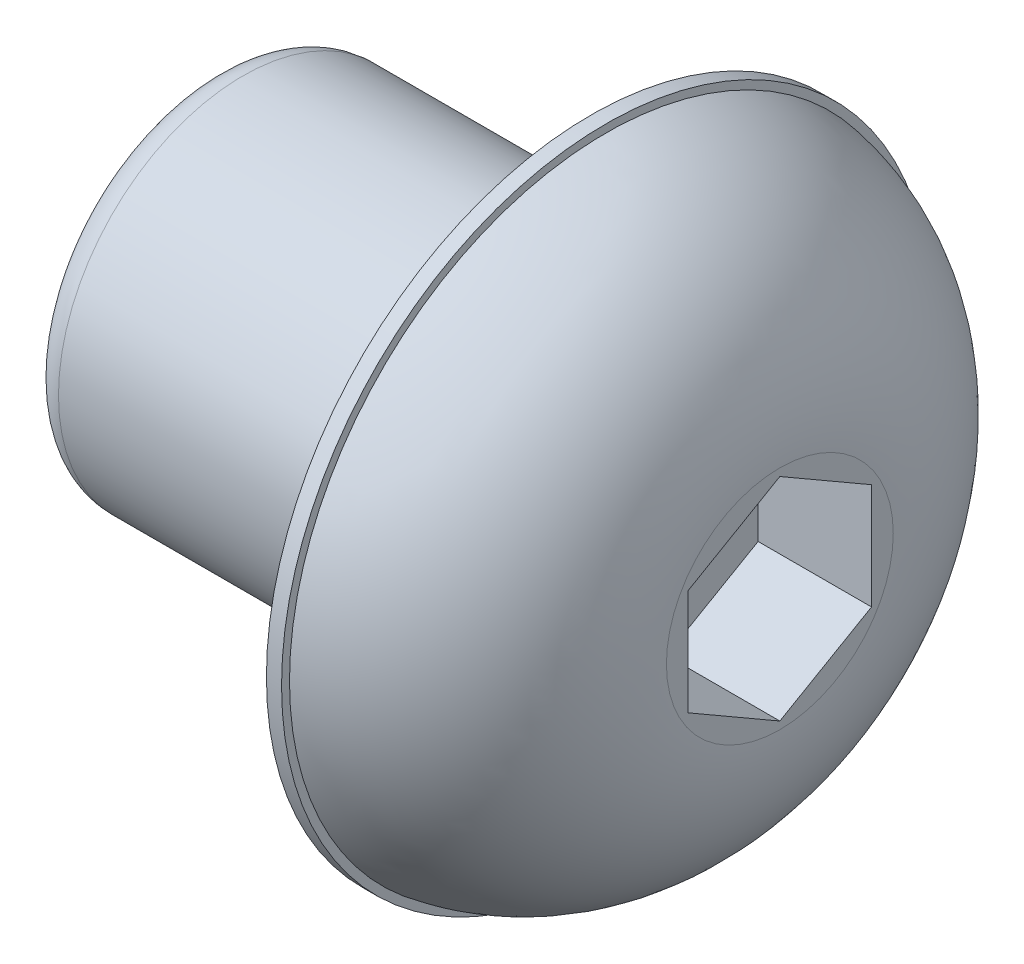
ISO-10303-21;
HEADER;
FILE_DESCRIPTION(('STEP AP214'),'2;1');
FILE_NAME('part.step','',(''),(''),'','','');
FILE_SCHEMA(('AUTOMOTIVE_DESIGN { 1 0 10303 214 1 1 1 1 }'));
ENDSEC;
DATA;
#1=APPLICATION_CONTEXT('core data for automotive mechanical design processes');
#2=APPLICATION_PROTOCOL_DEFINITION('international standard','automotive_design',2000,#1);
#3=PRODUCT_CONTEXT('',#1,'mechanical');
#4=PRODUCT('Part','Part','',(#3));
#5=PRODUCT_RELATED_PRODUCT_CATEGORY('part','',(#4));
#6=PRODUCT_DEFINITION_FORMATION('','',#4);
#7=PRODUCT_DEFINITION_CONTEXT('part definition',#1,'design');
#8=PRODUCT_DEFINITION('design','',#6,#7);
#9=PRODUCT_DEFINITION_SHAPE('','',#8);
#10=(LENGTH_UNIT() NAMED_UNIT(*) SI_UNIT(.MILLI.,.METRE.));
#11=(NAMED_UNIT(*) PLANE_ANGLE_UNIT() SI_UNIT($,.RADIAN.));
#12=(NAMED_UNIT(*) SI_UNIT($,.STERADIAN.) SOLID_ANGLE_UNIT());
#13=UNCERTAINTY_MEASURE_WITH_UNIT(LENGTH_MEASURE(1.E-05),#10,'distance_accuracy_value','');
#14=(GEOMETRIC_REPRESENTATION_CONTEXT(3) GLOBAL_UNCERTAINTY_ASSIGNED_CONTEXT((#13)) GLOBAL_UNIT_ASSIGNED_CONTEXT((#10,
#11,#12)) REPRESENTATION_CONTEXT('',''));
#15=CARTESIAN_POINT('',(0.,0.,0.));
#16=DIRECTION('',(0.,0.,1.));
#17=DIRECTION('',(1.,0.,0.));
#18=AXIS2_PLACEMENT_3D('',#15,#16,#17);
#19=CARTESIAN_POINT('',(0.,6.1976,0.));
#20=DIRECTION('',(-1.,0.,0.));
#21=DIRECTION('',(0.,0.,1.));
#22=AXIS2_PLACEMENT_3D('',#19,#20,#21);
#23=CYLINDRICAL_SURFACE('',#22,6.1976);
#24=CARTESIAN_POINT('',(1.016,6.1976,0.));
#25=DIRECTION('',(-1.,0.,0.));
#26=DIRECTION('',(0.,0.,1.));
#27=AXIS2_PLACEMENT_3D('',#24,#25,#26);
#28=CIRCLE('',#27,6.1976);
#29=CARTESIAN_POINT('',(1.016,6.1976,6.1976));
#30=VERTEX_POINT('',#29);
#31=EDGE_CURVE('E11',#30,#30,#28,.F.);
#32=ORIENTED_EDGE('',*,*,#31,.T.);
#33=EDGE_LOOP('',(#32));
#34=FACE_BOUND('',#33,.T.);
#35=CARTESIAN_POINT('',(12.7,6.1976,0.));
#36=DIRECTION('',(-1.,0.,0.));
#37=DIRECTION('',(0.,0.,1.));
#38=AXIS2_PLACEMENT_3D('',#35,#36,#37);
#39=CIRCLE('',#38,6.1976);
#40=CARTESIAN_POINT('',(12.7,6.1976,6.1976));
#41=VERTEX_POINT('',#40);
#42=EDGE_CURVE('E169',#41,#41,#39,.T.);
#43=ORIENTED_EDGE('',*,*,#42,.T.);
#44=EDGE_LOOP('',(#43));
#45=FACE_BOUND('',#44,.T.);
#46=ADVANCED_FACE('F43',(#34,#45),#23,.T.);
#47=CARTESIAN_POINT('',(0.,0.,0.));
#48=DIRECTION('',(-1.,0.,0.));
#49=DIRECTION('',(0.,0.,1.));
#50=AXIS2_PLACEMENT_3D('',#47,#48,#49);
#51=PLANE('',#50);
#52=CARTESIAN_POINT('',(0.,6.1976,0.));
#53=DIRECTION('',(-1.,0.,0.));
#54=DIRECTION('',(0.,0.,1.));
#55=AXIS2_PLACEMENT_3D('',#52,#53,#54);
#56=CIRCLE('',#55,5.1816);
#57=CARTESIAN_POINT('',(0.,6.1976,5.1816));
#58=VERTEX_POINT('',#57);
#59=EDGE_CURVE('E52',#58,#58,#56,.T.);
#60=ORIENTED_EDGE('',*,*,#59,.T.);
#61=EDGE_LOOP('',(#60));
#62=FACE_BOUND('',#61,.T.);
#63=ADVANCED_FACE('F188',(#62),#51,.T.);
#64=CARTESIAN_POINT('',(12.1482540217391,6.1976,0.));
#65=DIRECTION('',(-1.,0.,0.));
#66=DIRECTION('',(0.,0.,1.));
#67=AXIS2_PLACEMENT_3D('',#64,#65,#66);
#68=DEGENERATE_TOROIDAL_SURFACE('',#67,3.81,6.90174597826087,.T.);
#69=CARTESIAN_POINT('',(19.05,6.1976,0.));
#70=DIRECTION('',(1.,0.,0.));
#71=DIRECTION('',(0.,0.,-1.));
#72=AXIS2_PLACEMENT_3D('',#69,#70,#71);
#73=CIRCLE('',#72,3.81);
#74=CARTESIAN_POINT('',(19.05,6.1976,-3.81));
#75=VERTEX_POINT('',#74);
#76=EDGE_CURVE('E113',#75,#75,#73,.T.);
#77=ORIENTED_EDGE('',*,*,#76,.F.);
#78=EDGE_LOOP('',(#77));
#79=FACE_BOUND('',#78,.T.);
#80=CARTESIAN_POINT('',(13.208,6.1976,0.));
#81=DIRECTION('',(-1.,0.,0.));
#82=DIRECTION('',(0.,0.,1.));
#83=AXIS2_PLACEMENT_3D('',#80,#81,#82);
#84=CIRCLE('',#83,10.6299);
#85=CARTESIAN_POINT('',(13.208,6.1976,10.6299));
#86=VERTEX_POINT('',#85);
#87=EDGE_CURVE('E181',#86,#86,#84,.T.);
#88=ORIENTED_EDGE('',*,*,#87,.F.);
#89=EDGE_LOOP('',(#88));
#90=FACE_BOUND('',#89,.T.);
#91=ADVANCED_FACE('F204',(#79,#90),#68,.T.);
#92=CARTESIAN_POINT('',(13.208,-4.699,0.));
#93=DIRECTION('',(1.,0.,0.));
#94=DIRECTION('',(0.,0.,-1.));
#95=AXIS2_PLACEMENT_3D('',#92,#93,#94);
#96=PLANE('',#95);
#97=ORIENTED_EDGE('',*,*,#87,.T.);
#98=EDGE_LOOP('',(#97));
#99=FACE_BOUND('',#98,.T.);
#100=CARTESIAN_POINT('',(13.208,6.1976,0.));
#101=DIRECTION('',(-1.,0.,0.));
#102=DIRECTION('',(0.,0.,1.));
#103=AXIS2_PLACEMENT_3D('',#100,#101,#102);
#104=CIRCLE('',#103,10.8966);
#105=CARTESIAN_POINT('',(13.208,6.1976,10.8966));
#106=VERTEX_POINT('',#105);
#107=EDGE_CURVE('E177',#106,#106,#104,.T.);
#108=ORIENTED_EDGE('',*,*,#107,.F.);
#109=EDGE_LOOP('',(#108));
#110=FACE_BOUND('',#109,.T.);
#111=ADVANCED_FACE('F210',(#99,#110),#96,.T.);
#112=CARTESIAN_POINT('',(0.,6.1976,0.));
#113=DIRECTION('',(-1.,0.,0.));
#114=DIRECTION('',(0.,0.,1.));
#115=AXIS2_PLACEMENT_3D('',#112,#113,#114);
#116=CYLINDRICAL_SURFACE('',#115,10.8966);
#117=ORIENTED_EDGE('',*,*,#107,.T.);
#118=EDGE_LOOP('',(#117));
#119=FACE_BOUND('',#118,.T.);
#120=CARTESIAN_POINT('',(12.7,6.1976,0.));
#121=DIRECTION('',(-1.,0.,0.));
#122=DIRECTION('',(0.,0.,1.));
#123=AXIS2_PLACEMENT_3D('',#120,#121,#122);
#124=CIRCLE('',#123,10.8966);
#125=CARTESIAN_POINT('',(12.7,6.1976,10.8966));
#126=VERTEX_POINT('',#125);
#127=EDGE_CURVE('E173',#126,#126,#124,.T.);
#128=ORIENTED_EDGE('',*,*,#127,.F.);
#129=EDGE_LOOP('',(#128));
#130=FACE_BOUND('',#129,.T.);
#131=ADVANCED_FACE('F214',(#119,#130),#116,.T.);
#132=CARTESIAN_POINT('',(12.7,0.,0.));
#133=DIRECTION('',(-1.,0.,0.));
#134=DIRECTION('',(0.,0.,1.));
#135=AXIS2_PLACEMENT_3D('',#132,#133,#134);
#136=PLANE('',#135);
#137=ORIENTED_EDGE('',*,*,#127,.T.);
#138=EDGE_LOOP('',(#137));
#139=FACE_BOUND('',#138,.T.);
#140=ORIENTED_EDGE('',*,*,#42,.F.);
#141=EDGE_LOOP('',(#140));
#142=FACE_BOUND('',#141,.T.);
#143=ADVANCED_FACE('F218',(#139,#142),#136,.T.);
#144=CARTESIAN_POINT('',(19.05,6.1976,0.));
#145=DIRECTION('',(1.,0.,0.));
#146=DIRECTION('',(0.,0.,-1.));
#147=AXIS2_PLACEMENT_3D('',#144,#145,#146);
#148=PLANE('',#147);
#149=ORIENTED_EDGE('',*,*,#76,.T.);
#150=EDGE_LOOP('',(#149));
#151=FACE_BOUND('',#150,.T.);
#152=DIRECTION('',(0.,0.5,-0.866025403784439));
#153=VECTOR('',#152,1.);
#154=CARTESIAN_POINT('',(19.05,2.6414110169265,0.));
#155=LINE('',#154,#153);
#156=CARTESIAN_POINT('',(19.05,2.6414110169265,0.));
#157=VERTEX_POINT('',#156);
#158=CARTESIAN_POINT('',(19.05,4.41950550846325,-3.07975));
#159=VERTEX_POINT('',#158);
#160=EDGE_CURVE('E106',#157,#159,#155,.T.);
#161=ORIENTED_EDGE('',*,*,#160,.F.);
#162=DIRECTION('',(0.,-0.5,-0.866025403784439));
#163=VECTOR('',#162,1.);
#164=CARTESIAN_POINT('',(19.05,4.41950550846325,3.07975));
#165=LINE('',#164,#163);
#166=CARTESIAN_POINT('',(19.05,4.41950550846325,3.07975));
#167=VERTEX_POINT('',#166);
#168=EDGE_CURVE('E96',#167,#157,#165,.T.);
#169=ORIENTED_EDGE('',*,*,#168,.F.);
#170=DIRECTION('',(0.,-1.,0.));
#171=VECTOR('',#170,1.);
#172=CARTESIAN_POINT('',(19.05,7.97569449153675,3.07975));
#173=LINE('',#172,#171);
#174=CARTESIAN_POINT('',(19.05,7.97569449153675,3.07975));
#175=VERTEX_POINT('',#174);
#176=EDGE_CURVE('E132',#175,#167,#173,.T.);
#177=ORIENTED_EDGE('',*,*,#176,.F.);
#178=DIRECTION('',(0.,-0.5,0.866025403784439));
#179=VECTOR('',#178,1.);
#180=CARTESIAN_POINT('',(19.05,9.7537889830735,0.));
#181=LINE('',#180,#179);
#182=CARTESIAN_POINT('',(19.05,9.7537889830735,0.));
#183=VERTEX_POINT('',#182);
#184=EDGE_CURVE('E128',#183,#175,#181,.T.);
#185=ORIENTED_EDGE('',*,*,#184,.F.);
#186=DIRECTION('',(0.,0.5,0.866025403784439));
#187=VECTOR('',#186,1.);
#188=CARTESIAN_POINT('',(19.05,7.97569449153675,-3.07975));
#189=LINE('',#188,#187);
#190=CARTESIAN_POINT('',(19.05,7.97569449153675,-3.07975));
#191=VERTEX_POINT('',#190);
#192=EDGE_CURVE('E123',#191,#183,#189,.T.);
#193=ORIENTED_EDGE('',*,*,#192,.F.);
#194=DIRECTION('',(0.,1.,0.));
#195=VECTOR('',#194,1.);
#196=CARTESIAN_POINT('',(19.05,4.41950550846325,-3.07975));
#197=LINE('',#196,#195);
#198=EDGE_CURVE('E119',#159,#191,#197,.T.);
#199=ORIENTED_EDGE('',*,*,#198,.F.);
#200=EDGE_LOOP('',(#161,#169,#177,#185,#193,#199));
#201=FACE_BOUND('',#200,.T.);
#202=ADVANCED_FACE('F117',(#151,#201),#148,.T.);
#203=CARTESIAN_POINT('',(19.05,4.41950550846325,3.07975));
#204=DIRECTION('',(0.,0.866025403784439,-0.5));
#205=DIRECTION('',(0.,0.5,0.866025403784439));
#206=AXIS2_PLACEMENT_3D('',#203,#204,#205);
#207=PLANE('',#206);
#208=DIRECTION('',(0.,-0.5,-0.866025403784439));
#209=VECTOR('',#208,1.);
#210=CARTESIAN_POINT('',(15.24,4.41950550846325,3.07975));
#211=LINE('',#210,#209);
#212=CARTESIAN_POINT('',(15.24,4.41950550846325,3.07975));
#213=VERTEX_POINT('',#212);
#214=CARTESIAN_POINT('',(15.24,2.6414110169265,0.));
#215=VERTEX_POINT('',#214);
#216=EDGE_CURVE('E59',#213,#215,#211,.T.);
#217=ORIENTED_EDGE('',*,*,#216,.F.);
#218=DIRECTION('',(-1.,0.,0.));
#219=VECTOR('',#218,1.);
#220=CARTESIAN_POINT('',(19.05,4.41950550846325,3.07975));
#221=LINE('',#220,#219);
#222=EDGE_CURVE('E101',#167,#213,#221,.T.);
#223=ORIENTED_EDGE('',*,*,#222,.F.);
#224=ORIENTED_EDGE('',*,*,#168,.T.);
#225=DIRECTION('',(-1.,0.,0.));
#226=VECTOR('',#225,1.);
#227=CARTESIAN_POINT('',(19.05,2.6414110169265,0.));
#228=LINE('',#227,#226);
#229=EDGE_CURVE('E99',#157,#215,#228,.T.);
#230=ORIENTED_EDGE('',*,*,#229,.T.);
#231=EDGE_LOOP('',(#217,#223,#224,#230));
#232=FACE_BOUND('',#231,.T.);
#233=ADVANCED_FACE('F98',(#232),#207,.T.);
#234=CARTESIAN_POINT('',(19.05,2.6414110169265,0.));
#235=DIRECTION('',(0.,0.866025403784439,0.5));
#236=DIRECTION('',(0.,-0.5,0.866025403784439));
#237=AXIS2_PLACEMENT_3D('',#234,#235,#236);
#238=PLANE('',#237);
#239=DIRECTION('',(0.,0.5,-0.866025403784439));
#240=VECTOR('',#239,1.);
#241=CARTESIAN_POINT('',(15.24,2.6414110169265,0.));
#242=LINE('',#241,#240);
#243=CARTESIAN_POINT('',(15.24,4.41950550846325,-3.07975));
#244=VERTEX_POINT('',#243);
#245=EDGE_CURVE('E63',#215,#244,#242,.T.);
#246=ORIENTED_EDGE('',*,*,#245,.F.);
#247=ORIENTED_EDGE('',*,*,#229,.F.);
#248=ORIENTED_EDGE('',*,*,#160,.T.);
#249=DIRECTION('',(-1.,0.,0.));
#250=VECTOR('',#249,1.);
#251=CARTESIAN_POINT('',(19.05,4.41950550846325,-3.07975));
#252=LINE('',#251,#250);
#253=EDGE_CURVE('E114',#159,#244,#252,.T.);
#254=ORIENTED_EDGE('',*,*,#253,.T.);
#255=EDGE_LOOP('',(#246,#247,#248,#254));
#256=FACE_BOUND('',#255,.T.);
#257=ADVANCED_FACE('F110',(#256),#238,.T.);
#258=CARTESIAN_POINT('',(19.05,4.41950550846325,-3.07975));
#259=DIRECTION('',(0.,0.,1.));
#260=DIRECTION('',(0.,-1.,0.));
#261=AXIS2_PLACEMENT_3D('',#258,#259,#260);
#262=PLANE('',#261);
#263=DIRECTION('',(0.,1.,0.));
#264=VECTOR('',#263,1.);
#265=CARTESIAN_POINT('',(15.24,4.41950550846325,-3.07975));
#266=LINE('',#265,#264);
#267=CARTESIAN_POINT('',(15.24,7.97569449153675,-3.07975));
#268=VERTEX_POINT('',#267);
#269=EDGE_CURVE('E139',#244,#268,#266,.T.);
#270=ORIENTED_EDGE('',*,*,#269,.F.);
#271=ORIENTED_EDGE('',*,*,#253,.F.);
#272=ORIENTED_EDGE('',*,*,#198,.T.);
#273=DIRECTION('',(-1.,0.,0.));
#274=VECTOR('',#273,1.);
#275=CARTESIAN_POINT('',(19.05,7.97569449153675,-3.07975));
#276=LINE('',#275,#274);
#277=EDGE_CURVE('E160',#191,#268,#276,.T.);
#278=ORIENTED_EDGE('',*,*,#277,.T.);
#279=EDGE_LOOP('',(#270,#271,#272,#278));
#280=FACE_BOUND('',#279,.T.);
#281=ADVANCED_FACE('F230',(#280),#262,.T.);
#282=CARTESIAN_POINT('',(19.05,7.97569449153675,-3.07975));
#283=DIRECTION('',(0.,-0.866025403784439,0.5));
#284=DIRECTION('',(0.,-0.5,-0.866025403784439));
#285=AXIS2_PLACEMENT_3D('',#282,#283,#284);
#286=PLANE('',#285);
#287=DIRECTION('',(0.,0.5,0.866025403784439));
#288=VECTOR('',#287,1.);
#289=CARTESIAN_POINT('',(15.24,7.97569449153675,-3.07975));
#290=LINE('',#289,#288);
#291=CARTESIAN_POINT('',(15.24,9.7537889830735,0.));
#292=VERTEX_POINT('',#291);
#293=EDGE_CURVE('E142',#268,#292,#290,.T.);
#294=ORIENTED_EDGE('',*,*,#293,.F.);
#295=ORIENTED_EDGE('',*,*,#277,.F.);
#296=ORIENTED_EDGE('',*,*,#192,.T.);
#297=DIRECTION('',(-1.,0.,0.));
#298=VECTOR('',#297,1.);
#299=CARTESIAN_POINT('',(19.05,9.7537889830735,0.));
#300=LINE('',#299,#298);
#301=EDGE_CURVE('E156',#183,#292,#300,.T.);
#302=ORIENTED_EDGE('',*,*,#301,.T.);
#303=EDGE_LOOP('',(#294,#295,#296,#302));
#304=FACE_BOUND('',#303,.T.);
#305=ADVANCED_FACE('F233',(#304),#286,.T.);
#306=CARTESIAN_POINT('',(19.05,9.7537889830735,0.));
#307=DIRECTION('',(0.,-0.866025403784439,-0.5));
#308=DIRECTION('',(0.,0.5,-0.866025403784439));
#309=AXIS2_PLACEMENT_3D('',#306,#307,#308);
#310=PLANE('',#309);
#311=DIRECTION('',(0.,-0.5,0.866025403784439));
#312=VECTOR('',#311,1.);
#313=CARTESIAN_POINT('',(15.24,9.7537889830735,0.));
#314=LINE('',#313,#312);
#315=CARTESIAN_POINT('',(15.24,7.97569449153675,3.07975));
#316=VERTEX_POINT('',#315);
#317=EDGE_CURVE('E145',#292,#316,#314,.T.);
#318=ORIENTED_EDGE('',*,*,#317,.F.);
#319=ORIENTED_EDGE('',*,*,#301,.F.);
#320=ORIENTED_EDGE('',*,*,#184,.T.);
#321=DIRECTION('',(-1.,0.,0.));
#322=VECTOR('',#321,1.);
#323=CARTESIAN_POINT('',(19.05,7.97569449153675,3.07975));
#324=LINE('',#323,#322);
#325=EDGE_CURVE('E152',#175,#316,#324,.T.);
#326=ORIENTED_EDGE('',*,*,#325,.T.);
#327=EDGE_LOOP('',(#318,#319,#320,#326));
#328=FACE_BOUND('',#327,.T.);
#329=ADVANCED_FACE('F237',(#328),#310,.T.);
#330=CARTESIAN_POINT('',(19.05,7.97569449153675,3.07975));
#331=DIRECTION('',(0.,0.,-1.));
#332=DIRECTION('',(0.,1.,0.));
#333=AXIS2_PLACEMENT_3D('',#330,#331,#332);
#334=PLANE('',#333);
#335=DIRECTION('',(0.,-1.,0.));
#336=VECTOR('',#335,1.);
#337=CARTESIAN_POINT('',(15.24,7.97569449153675,3.07975));
#338=LINE('',#337,#336);
#339=EDGE_CURVE('E107',#316,#213,#338,.T.);
#340=ORIENTED_EDGE('',*,*,#339,.F.);
#341=ORIENTED_EDGE('',*,*,#325,.F.);
#342=ORIENTED_EDGE('',*,*,#176,.T.);
#343=ORIENTED_EDGE('',*,*,#222,.T.);
#344=EDGE_LOOP('',(#340,#341,#342,#343));
#345=FACE_BOUND('',#344,.T.);
#346=ADVANCED_FACE('F196',(#345),#334,.T.);
#347=CARTESIAN_POINT('',(15.24,2.3876,0.));
#348=DIRECTION('',(1.,0.,0.));
#349=DIRECTION('',(0.,0.,-1.));
#350=AXIS2_PLACEMENT_3D('',#347,#348,#349);
#351=PLANE('',#350);
#352=ORIENTED_EDGE('',*,*,#216,.T.);
#353=ORIENTED_EDGE('',*,*,#245,.T.);
#354=ORIENTED_EDGE('',*,*,#269,.T.);
#355=ORIENTED_EDGE('',*,*,#293,.T.);
#356=ORIENTED_EDGE('',*,*,#317,.T.);
#357=ORIENTED_EDGE('',*,*,#339,.T.);
#358=EDGE_LOOP('',(#352,#353,#354,#355,#356,#357));
#359=FACE_BOUND('',#358,.T.);
#360=ADVANCED_FACE('F191',(#359),#351,.T.);
#361=CARTESIAN_POINT('',(1.016,6.1976,0.));
#362=DIRECTION('',(-1.,0.,0.));
#363=DIRECTION('',(0.,0.,1.));
#364=AXIS2_PLACEMENT_3D('',#361,#362,#363);
#365=TOROIDAL_SURFACE('',#364,5.1816,1.016);
#366=ORIENTED_EDGE('',*,*,#31,.F.);
#367=EDGE_LOOP('',(#366));
#368=FACE_BOUND('',#367,.T.);
#369=ORIENTED_EDGE('',*,*,#59,.F.);
#370=EDGE_LOOP('',(#369));
#371=FACE_BOUND('',#370,.T.);
#372=ADVANCED_FACE('F45',(#368,#371),#365,.T.);
#373=CLOSED_SHELL('',(#46,#63,#91,#111,#131,#143,#202,#233,#257,#281,#305,#329,#346,#360,#372));
#374=MANIFOLD_SOLID_BREP('B2',#373);
#375=ADVANCED_BREP_SHAPE_REPRESENTATION('',(#18,#374),#14);
#376=SHAPE_DEFINITION_REPRESENTATION(#9,#375);
ENDSEC;
END-ISO-10303-21;
